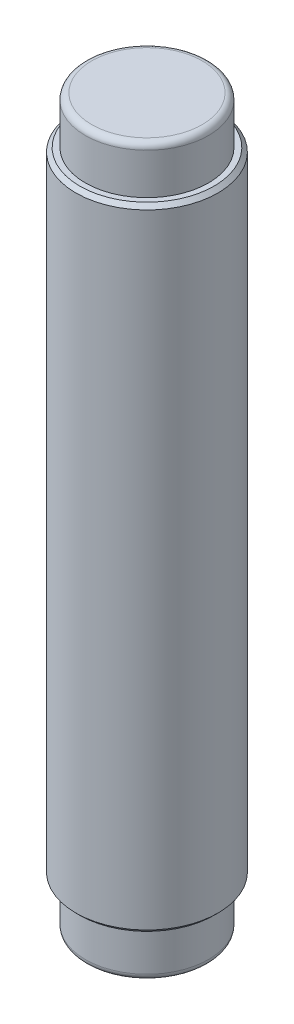
ISO-10303-21;
HEADER;
FILE_DESCRIPTION(('STEP AP214'),'2;1');
FILE_NAME('part.step','',(''),(''),'','','');
FILE_SCHEMA(('AUTOMOTIVE_DESIGN { 1 0 10303 214 1 1 1 1 }'));
ENDSEC;
DATA;
#1=APPLICATION_CONTEXT('core data for automotive mechanical design processes');
#2=APPLICATION_PROTOCOL_DEFINITION('international standard','automotive_design',2000,#1);
#3=PRODUCT_CONTEXT('',#1,'mechanical');
#4=PRODUCT('Part','Part','',(#3));
#5=PRODUCT_RELATED_PRODUCT_CATEGORY('part','',(#4));
#6=PRODUCT_DEFINITION_FORMATION('','',#4);
#7=PRODUCT_DEFINITION_CONTEXT('part definition',#1,'design');
#8=PRODUCT_DEFINITION('design','',#6,#7);
#9=PRODUCT_DEFINITION_SHAPE('','',#8);
#10=(LENGTH_UNIT() NAMED_UNIT(*) SI_UNIT(.MILLI.,.METRE.));
#11=(NAMED_UNIT(*) PLANE_ANGLE_UNIT() SI_UNIT($,.RADIAN.));
#12=(NAMED_UNIT(*) SI_UNIT($,.STERADIAN.) SOLID_ANGLE_UNIT());
#13=UNCERTAINTY_MEASURE_WITH_UNIT(LENGTH_MEASURE(1.E-05),#10,'distance_accuracy_value','');
#14=(GEOMETRIC_REPRESENTATION_CONTEXT(3) GLOBAL_UNCERTAINTY_ASSIGNED_CONTEXT((#13)) GLOBAL_UNIT_ASSIGNED_CONTEXT((#10,
#11,#12)) REPRESENTATION_CONTEXT('',''));
#15=CARTESIAN_POINT('',(0.,0.,0.));
#16=DIRECTION('',(0.,0.,1.));
#17=DIRECTION('',(1.,0.,0.));
#18=AXIS2_PLACEMENT_3D('',#15,#16,#17);
#19=CARTESIAN_POINT('',(0.,46.,0.));
#20=DIRECTION('',(0.,-1.,0.));
#21=DIRECTION('',(0.,0.,-1.));
#22=AXIS2_PLACEMENT_3D('',#19,#20,#21);
#23=CYLINDRICAL_SURFACE('',#22,3.9);
#24=CARTESIAN_POINT('',(0.,43.,0.));
#25=DIRECTION('',(0.,1.,0.));
#26=DIRECTION('',(0.,0.,1.));
#27=AXIS2_PLACEMENT_3D('',#24,#25,#26);
#28=CIRCLE('',#27,3.9);
#29=CARTESIAN_POINT('',(0.,43.,3.9));
#30=VERTEX_POINT('',#29);
#31=EDGE_CURVE('E70',#30,#30,#28,.T.);
#32=ORIENTED_EDGE('',*,*,#31,.T.);
#33=EDGE_LOOP('',(#32));
#34=FACE_BOUND('',#33,.T.);
#35=CARTESIAN_POINT('',(0.,45.6,0.));
#36=DIRECTION('',(0.,1.,0.));
#37=DIRECTION('',(0.,0.,1.));
#38=AXIS2_PLACEMENT_3D('',#35,#36,#37);
#39=CIRCLE('',#38,3.9);
#40=CARTESIAN_POINT('',(0.,45.6,3.9));
#41=VERTEX_POINT('',#40);
#42=EDGE_CURVE('E66',#41,#41,#39,.F.);
#43=ORIENTED_EDGE('',*,*,#42,.T.);
#44=EDGE_LOOP('',(#43));
#45=FACE_BOUND('',#44,.T.);
#46=ADVANCED_FACE('F44',(#34,#45),#23,.T.);
#47=CARTESIAN_POINT('',(0.,46.,0.));
#48=DIRECTION('',(0.,1.,0.));
#49=DIRECTION('',(0.,0.,1.));
#50=AXIS2_PLACEMENT_3D('',#47,#48,#49);
#51=PLANE('',#50);
#52=CARTESIAN_POINT('',(0.,46.,0.));
#53=DIRECTION('',(0.,1.,0.));
#54=DIRECTION('',(0.,0.,1.));
#55=AXIS2_PLACEMENT_3D('',#52,#53,#54);
#56=CIRCLE('',#55,3.5);
#57=CARTESIAN_POINT('',(0.,46.,3.5));
#58=VERTEX_POINT('',#57);
#59=EDGE_CURVE('E73',#58,#58,#56,.T.);
#60=ORIENTED_EDGE('',*,*,#59,.T.);
#61=EDGE_LOOP('',(#60));
#62=FACE_BOUND('',#61,.T.);
#63=ADVANCED_FACE('F86',(#62),#51,.T.);
#64=CARTESIAN_POINT('',(0.,45.6,0.));
#65=DIRECTION('',(0.,1.,0.));
#66=DIRECTION('',(0.,0.,1.));
#67=AXIS2_PLACEMENT_3D('',#64,#65,#66);
#68=TOROIDAL_SURFACE('',#67,3.5,0.4);
#69=ORIENTED_EDGE('',*,*,#42,.F.);
#70=EDGE_LOOP('',(#69));
#71=FACE_BOUND('',#70,.T.);
#72=ORIENTED_EDGE('',*,*,#59,.F.);
#73=EDGE_LOOP('',(#72));
#74=FACE_BOUND('',#73,.T.);
#75=ADVANCED_FACE('F87',(#71,#74),#68,.T.);
#76=CARTESIAN_POINT('',(0.,43.,0.));
#77=DIRECTION('',(0.,-1.,0.));
#78=DIRECTION('',(0.,0.,-1.));
#79=AXIS2_PLACEMENT_3D('',#76,#77,#78);
#80=CYLINDRICAL_SURFACE('',#79,4.5);
#81=CARTESIAN_POINT('',(0.,3.25,0.));
#82=DIRECTION('',(0.,1.,0.));
#83=DIRECTION('',(0.,0.,1.));
#84=AXIS2_PLACEMENT_3D('',#81,#82,#83);
#85=CIRCLE('',#84,4.5);
#86=CARTESIAN_POINT('',(0.,3.25,4.5));
#87=VERTEX_POINT('',#86);
#88=EDGE_CURVE('E60',#87,#87,#85,.T.);
#89=ORIENTED_EDGE('',*,*,#88,.T.);
#90=EDGE_LOOP('',(#89));
#91=FACE_BOUND('',#90,.T.);
#92=CARTESIAN_POINT('',(0.,42.75,0.));
#93=DIRECTION('',(0.,1.,0.));
#94=DIRECTION('',(0.,0.,1.));
#95=AXIS2_PLACEMENT_3D('',#92,#93,#94);
#96=CIRCLE('',#95,4.5);
#97=CARTESIAN_POINT('',(0.,42.75,4.5));
#98=VERTEX_POINT('',#97);
#99=EDGE_CURVE('E62',#98,#98,#96,.F.);
#100=ORIENTED_EDGE('',*,*,#99,.T.);
#101=EDGE_LOOP('',(#100));
#102=FACE_BOUND('',#101,.T.);
#103=ADVANCED_FACE('F89',(#91,#102),#80,.T.);
#104=CARTESIAN_POINT('',(0.,43.,0.));
#105=DIRECTION('',(0.,1.,0.));
#106=DIRECTION('',(0.,0.,1.));
#107=AXIS2_PLACEMENT_3D('',#104,#105,#106);
#108=PLANE('',#107);
#109=CARTESIAN_POINT('',(0.,43.,0.));
#110=DIRECTION('',(0.,1.,0.));
#111=DIRECTION('',(0.,0.,1.));
#112=AXIS2_PLACEMENT_3D('',#109,#110,#111);
#113=CIRCLE('',#112,4.25);
#114=CARTESIAN_POINT('',(0.,43.,4.25));
#115=VERTEX_POINT('',#114);
#116=EDGE_CURVE('E10',#115,#115,#113,.T.);
#117=ORIENTED_EDGE('',*,*,#116,.T.);
#118=EDGE_LOOP('',(#117));
#119=FACE_BOUND('',#118,.T.);
#120=ORIENTED_EDGE('',*,*,#31,.F.);
#121=EDGE_LOOP('',(#120));
#122=FACE_BOUND('',#121,.T.);
#123=ADVANCED_FACE('F132',(#119,#122),#108,.T.);
#124=CARTESIAN_POINT('',(0.,3.,0.));
#125=DIRECTION('',(0.,1.,0.));
#126=DIRECTION('',(0.,0.,1.));
#127=AXIS2_PLACEMENT_3D('',#124,#125,#126);
#128=PLANE('',#127);
#129=CARTESIAN_POINT('',(0.,3.,0.));
#130=DIRECTION('',(0.,1.,0.));
#131=DIRECTION('',(0.,0.,1.));
#132=AXIS2_PLACEMENT_3D('',#129,#130,#131);
#133=CIRCLE('',#132,4.25);
#134=CARTESIAN_POINT('',(0.,3.,4.25));
#135=VERTEX_POINT('',#134);
#136=EDGE_CURVE('E52',#135,#135,#133,.F.);
#137=ORIENTED_EDGE('',*,*,#136,.T.);
#138=EDGE_LOOP('',(#137));
#139=FACE_BOUND('',#138,.T.);
#140=CARTESIAN_POINT('',(0.,3.,0.));
#141=DIRECTION('',(0.,1.,0.));
#142=DIRECTION('',(0.,0.,1.));
#143=AXIS2_PLACEMENT_3D('',#140,#141,#142);
#144=CIRCLE('',#143,3.9);
#145=CARTESIAN_POINT('',(0.,3.,3.9));
#146=VERTEX_POINT('',#145);
#147=EDGE_CURVE('E67',#146,#146,#144,.T.);
#148=ORIENTED_EDGE('',*,*,#147,.T.);
#149=EDGE_LOOP('',(#148));
#150=FACE_BOUND('',#149,.T.);
#151=ADVANCED_FACE('F108',(#139,#150),#128,.F.);
#152=CARTESIAN_POINT('',(0.,0.,0.));
#153=DIRECTION('',(0.,1.,0.));
#154=DIRECTION('',(0.,0.,1.));
#155=AXIS2_PLACEMENT_3D('',#152,#153,#154);
#156=PLANE('',#155);
#157=CARTESIAN_POINT('',(0.,0.,0.));
#158=DIRECTION('',(0.,1.,0.));
#159=DIRECTION('',(0.,0.,1.));
#160=AXIS2_PLACEMENT_3D('',#157,#158,#159);
#161=CIRCLE('',#160,3.5);
#162=CARTESIAN_POINT('',(0.,0.,3.5));
#163=VERTEX_POINT('',#162);
#164=EDGE_CURVE('E77',#163,#163,#161,.F.);
#165=ORIENTED_EDGE('',*,*,#164,.T.);
#166=EDGE_LOOP('',(#165));
#167=FACE_BOUND('',#166,.T.);
#168=ADVANCED_FACE('F106',(#167),#156,.F.);
#169=CARTESIAN_POINT('',(0.,0.399999999999998,0.));
#170=DIRECTION('',(0.,1.,0.));
#171=DIRECTION('',(0.,0.,1.));
#172=AXIS2_PLACEMENT_3D('',#169,#170,#171);
#173=TOROIDAL_SURFACE('',#172,3.5,0.4);
#174=ORIENTED_EDGE('',*,*,#164,.F.);
#175=EDGE_LOOP('',(#174));
#176=FACE_BOUND('',#175,.T.);
#177=CARTESIAN_POINT('',(0.,0.399999999999998,0.));
#178=DIRECTION('',(0.,1.,0.));
#179=DIRECTION('',(0.,0.,1.));
#180=AXIS2_PLACEMENT_3D('',#177,#178,#179);
#181=CIRCLE('',#180,3.9);
#182=CARTESIAN_POINT('',(0.,0.399999999999998,3.9));
#183=VERTEX_POINT('',#182);
#184=EDGE_CURVE('E79',#183,#183,#181,.T.);
#185=ORIENTED_EDGE('',*,*,#184,.F.);
#186=EDGE_LOOP('',(#185));
#187=FACE_BOUND('',#186,.T.);
#188=ADVANCED_FACE('F110',(#176,#187),#173,.T.);
#189=ORIENTED_EDGE('',*,*,#184,.T.);
#190=EDGE_LOOP('',(#189));
#191=FACE_BOUND('',#190,.T.);
#192=ORIENTED_EDGE('',*,*,#147,.F.);
#193=EDGE_LOOP('',(#192));
#194=FACE_BOUND('',#193,.T.);
#195=ADVANCED_FACE('F105',(#191,#194),#23,.T.);
#196=CARTESIAN_POINT('',(0.,3.25,0.));
#197=DIRECTION('',(0.,1.,0.));
#198=DIRECTION('',(0.,0.,1.));
#199=AXIS2_PLACEMENT_3D('',#196,#197,#198);
#200=CONICAL_SURFACE('',#199,4.5,0.78539816339746);
#201=ORIENTED_EDGE('',*,*,#136,.F.);
#202=EDGE_LOOP('',(#201));
#203=FACE_BOUND('',#202,.T.);
#204=ORIENTED_EDGE('',*,*,#88,.F.);
#205=EDGE_LOOP('',(#204));
#206=FACE_BOUND('',#205,.T.);
#207=ADVANCED_FACE('F112',(#203,#206),#200,.T.);
#208=CARTESIAN_POINT('',(0.,43.,0.));
#209=DIRECTION('',(0.,-1.,0.));
#210=DIRECTION('',(0.,0.,-1.));
#211=AXIS2_PLACEMENT_3D('',#208,#209,#210);
#212=CONICAL_SURFACE('',#211,4.25,0.78539816339744);
#213=ORIENTED_EDGE('',*,*,#99,.F.);
#214=EDGE_LOOP('',(#213));
#215=FACE_BOUND('',#214,.T.);
#216=ORIENTED_EDGE('',*,*,#116,.F.);
#217=EDGE_LOOP('',(#216));
#218=FACE_BOUND('',#217,.T.);
#219=ADVANCED_FACE('F48',(#215,#218),#212,.T.);
#220=CLOSED_SHELL('',(#46,#63,#75,#103,#123,#151,#168,#188,#195,#207,#219));
#221=MANIFOLD_SOLID_BREP('B2',#220);
#222=ADVANCED_BREP_SHAPE_REPRESENTATION('',(#18,#221),#14);
#223=SHAPE_DEFINITION_REPRESENTATION(#9,#222);
ENDSEC;
END-ISO-10303-21;
